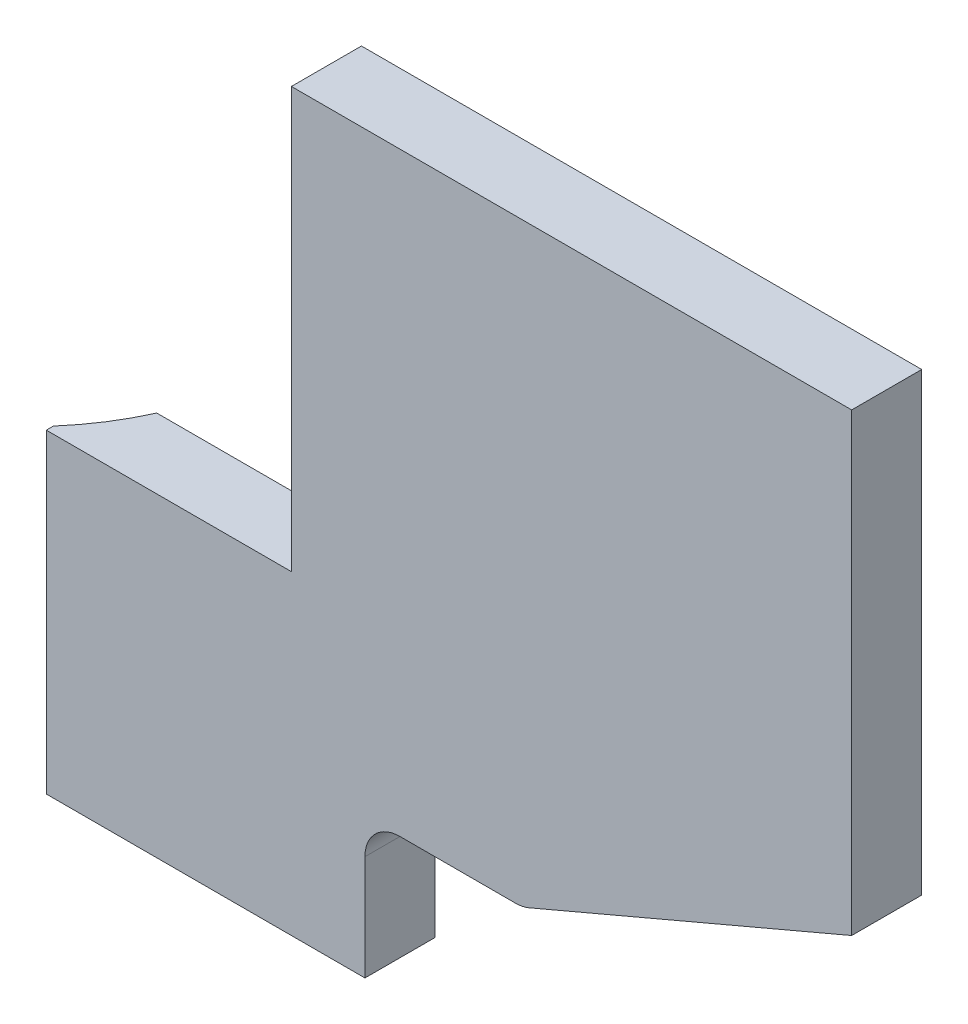
ISO-10303-21;
HEADER;
FILE_DESCRIPTION(('STEP AP214'),'2;1');
FILE_NAME('part.step','',(''),(''),'','','');
FILE_SCHEMA(('AUTOMOTIVE_DESIGN { 1 0 10303 214 1 1 1 1 }'));
ENDSEC;
DATA;
#1=APPLICATION_CONTEXT('core data for automotive mechanical design processes');
#2=APPLICATION_PROTOCOL_DEFINITION('international standard','automotive_design',2000,#1);
#3=PRODUCT_CONTEXT('',#1,'mechanical');
#4=PRODUCT('Part','Part','',(#3));
#5=PRODUCT_RELATED_PRODUCT_CATEGORY('part','',(#4));
#6=PRODUCT_DEFINITION_FORMATION('','',#4);
#7=PRODUCT_DEFINITION_CONTEXT('part definition',#1,'design');
#8=PRODUCT_DEFINITION('design','',#6,#7);
#9=PRODUCT_DEFINITION_SHAPE('','',#8);
#10=(LENGTH_UNIT() NAMED_UNIT(*) SI_UNIT(.MILLI.,.METRE.));
#11=(NAMED_UNIT(*) PLANE_ANGLE_UNIT() SI_UNIT($,.RADIAN.));
#12=(NAMED_UNIT(*) SI_UNIT($,.STERADIAN.) SOLID_ANGLE_UNIT());
#13=UNCERTAINTY_MEASURE_WITH_UNIT(LENGTH_MEASURE(1.E-05),#10,'distance_accuracy_value','');
#14=(GEOMETRIC_REPRESENTATION_CONTEXT(3) GLOBAL_UNCERTAINTY_ASSIGNED_CONTEXT((#13)) GLOBAL_UNIT_ASSIGNED_CONTEXT((#10,
#11,#12)) REPRESENTATION_CONTEXT('',''));
#15=CARTESIAN_POINT('',(0.,0.,0.));
#16=DIRECTION('',(0.,0.,1.));
#17=DIRECTION('',(1.,0.,0.));
#18=AXIS2_PLACEMENT_3D('',#15,#16,#17);
#19=CARTESIAN_POINT('',(0.,-72.5,0.));
#20=DIRECTION('',(0.,-1.,0.));
#21=DIRECTION('',(0.,0.,-1.));
#22=AXIS2_PLACEMENT_3D('',#19,#20,#21);
#23=PLANE('',#22);
#24=DIRECTION('',(1.,0.,0.));
#25=VECTOR('',#24,1.);
#26=CARTESIAN_POINT('',(-40.,-72.5,0.));
#27=LINE('',#26,#25);
#28=CARTESIAN_POINT('',(-69.2246337360503,-72.5,0.));
#29=VERTEX_POINT('',#28);
#30=CARTESIAN_POINT('',(-29.5,-72.5,0.));
#31=VERTEX_POINT('',#30);
#32=EDGE_CURVE('E144',#29,#31,#27,.T.);
#33=ORIENTED_EDGE('',*,*,#32,.T.);
#34=DIRECTION('',(0.,0.,1.));
#35=VECTOR('',#34,1.);
#36=CARTESIAN_POINT('',(-29.5,-72.5,0.));
#37=LINE('',#36,#35);
#38=CARTESIAN_POINT('',(-29.5,-72.5,10.));
#39=VERTEX_POINT('',#38);
#40=EDGE_CURVE('E126',#31,#39,#37,.T.);
#41=ORIENTED_EDGE('',*,*,#40,.T.);
#42=DIRECTION('',(-1.,0.,0.));
#43=VECTOR('',#42,1.);
#44=CARTESIAN_POINT('',(-40.,-72.5,10.));
#45=LINE('',#44,#43);
#46=CARTESIAN_POINT('',(-75.,-72.5,10.));
#47=VERTEX_POINT('',#46);
#48=EDGE_CURVE('E147',#39,#47,#45,.T.);
#49=ORIENTED_EDGE('',*,*,#48,.T.);
#50=DIRECTION('',(0.,0.,1.));
#51=VECTOR('',#50,1.);
#52=CARTESIAN_POINT('',(-75.,-72.5,0.));
#53=LINE('',#52,#51);
#54=CARTESIAN_POINT('',(-75.,-72.5,9.));
#55=VERTEX_POINT('',#54);
#56=EDGE_CURVE('E199',#55,#47,#53,.T.);
#57=ORIENTED_EDGE('',*,*,#56,.F.);
#58=CARTESIAN_POINT('',(-102.5,-72.5,-15.));
#59=DIRECTION('',(0.,1.,0.));
#60=DIRECTION('',(-1.,0.,0.));
#61=AXIS2_PLACEMENT_3D('',#58,#59,#60);
#62=CIRCLE('',#61,36.5);
#63=EDGE_CURVE('E61',#55,#29,#62,.T.);
#64=ORIENTED_EDGE('',*,*,#63,.T.);
#65=EDGE_LOOP('',(#33,#41,#49,#57,#64));
#66=FACE_BOUND('',#65,.T.);
#67=ADVANCED_FACE('F39',(#66),#23,.T.);
#68=CARTESIAN_POINT('',(40.,-32.5,10.));
#69=DIRECTION('',(-1.,0.,0.));
#70=DIRECTION('',(0.,0.,1.));
#71=AXIS2_PLACEMENT_3D('',#68,#69,#70);
#72=PLANE('',#71);
#73=DIRECTION('',(0.,0.,1.));
#74=VECTOR('',#73,1.);
#75=CARTESIAN_POINT('',(40.,-32.5,0.));
#76=LINE('',#75,#74);
#77=CARTESIAN_POINT('',(40.,-32.5,0.));
#78=VERTEX_POINT('',#77);
#79=CARTESIAN_POINT('',(40.,-32.5,10.));
#80=VERTEX_POINT('',#79);
#81=EDGE_CURVE('E140',#78,#80,#76,.T.);
#82=ORIENTED_EDGE('',*,*,#81,.F.);
#83=DIRECTION('',(0.,1.,0.));
#84=VECTOR('',#83,1.);
#85=CARTESIAN_POINT('',(40.,-32.5,0.));
#86=LINE('',#85,#84);
#87=CARTESIAN_POINT('',(40.,32.5,0.));
#88=VERTEX_POINT('',#87);
#89=EDGE_CURVE('E161',#78,#88,#86,.T.);
#90=ORIENTED_EDGE('',*,*,#89,.T.);
#91=DIRECTION('',(0.,0.,-1.));
#92=VECTOR('',#91,1.);
#93=CARTESIAN_POINT('',(40.,32.5,10.));
#94=LINE('',#93,#92);
#95=CARTESIAN_POINT('',(40.,32.5,10.));
#96=VERTEX_POINT('',#95);
#97=EDGE_CURVE('E50',#96,#88,#94,.T.);
#98=ORIENTED_EDGE('',*,*,#97,.F.);
#99=DIRECTION('',(0.,1.,0.));
#100=VECTOR('',#99,1.);
#101=CARTESIAN_POINT('',(40.,-32.5,10.));
#102=LINE('',#101,#100);
#103=EDGE_CURVE('E168',#80,#96,#102,.T.);
#104=ORIENTED_EDGE('',*,*,#103,.F.);
#105=EDGE_LOOP('',(#82,#90,#98,#104));
#106=FACE_BOUND('',#105,.T.);
#107=ADVANCED_FACE('F239',(#106),#72,.F.);
#108=CARTESIAN_POINT('',(-75.,-27.5,0.));
#109=DIRECTION('',(0.,-1.,0.));
#110=DIRECTION('',(1.,0.,0.));
#111=AXIS2_PLACEMENT_3D('',#108,#109,#110);
#112=PLANE('',#111);
#113=CARTESIAN_POINT('',(-102.5,-27.5,-15.));
#114=DIRECTION('',(0.,1.,0.));
#115=DIRECTION('',(-1.,0.,0.));
#116=AXIS2_PLACEMENT_3D('',#113,#114,#115);
#117=CIRCLE('',#116,36.5);
#118=CARTESIAN_POINT('',(-75.,-27.5,9.00000000000002));
#119=VERTEX_POINT('',#118);
#120=CARTESIAN_POINT('',(-69.2246337360503,-27.5,0.));
#121=VERTEX_POINT('',#120);
#122=EDGE_CURVE('E202',#119,#121,#117,.T.);
#123=ORIENTED_EDGE('',*,*,#122,.F.);
#124=DIRECTION('',(0.,0.,-1.));
#125=VECTOR('',#124,1.);
#126=CARTESIAN_POINT('',(-75.,-27.5,0.));
#127=LINE('',#126,#125);
#128=CARTESIAN_POINT('',(-75.,-27.5,10.));
#129=VERTEX_POINT('',#128);
#130=EDGE_CURVE('E191',#129,#119,#127,.T.);
#131=ORIENTED_EDGE('',*,*,#130,.F.);
#132=DIRECTION('',(1.,0.,0.));
#133=VECTOR('',#132,1.);
#134=CARTESIAN_POINT('',(-75.,-27.5,10.));
#135=LINE('',#134,#133);
#136=CARTESIAN_POINT('',(-40.,-27.5,10.));
#137=VERTEX_POINT('',#136);
#138=EDGE_CURVE('E151',#129,#137,#135,.T.);
#139=ORIENTED_EDGE('',*,*,#138,.T.);
#140=DIRECTION('',(0.,0.,-1.));
#141=VECTOR('',#140,1.);
#142=CARTESIAN_POINT('',(-40.,-27.5,0.));
#143=LINE('',#142,#141);
#144=CARTESIAN_POINT('',(-40.,-27.5,0.));
#145=VERTEX_POINT('',#144);
#146=EDGE_CURVE('E197',#137,#145,#143,.T.);
#147=ORIENTED_EDGE('',*,*,#146,.T.);
#148=DIRECTION('',(1.,0.,0.));
#149=VECTOR('',#148,1.);
#150=CARTESIAN_POINT('',(-75.,-27.5,0.));
#151=LINE('',#150,#149);
#152=EDGE_CURVE('E156',#121,#145,#151,.T.);
#153=ORIENTED_EDGE('',*,*,#152,.F.);
#154=EDGE_LOOP('',(#123,#131,#139,#147,#153));
#155=FACE_BOUND('',#154,.T.);
#156=ADVANCED_FACE('F266',(#155),#112,.F.);
#157=CARTESIAN_POINT('',(-40.,-32.5,10.));
#158=DIRECTION('',(-1.,0.,0.));
#159=DIRECTION('',(0.,-1.,0.));
#160=AXIS2_PLACEMENT_3D('',#157,#158,#159);
#161=PLANE('',#160);
#162=ORIENTED_EDGE('',*,*,#146,.F.);
#163=DIRECTION('',(0.,1.,0.));
#164=VECTOR('',#163,1.);
#165=CARTESIAN_POINT('',(-40.,-32.5,10.));
#166=LINE('',#165,#164);
#167=CARTESIAN_POINT('',(-40.,32.5,10.));
#168=VERTEX_POINT('',#167);
#169=EDGE_CURVE('E159',#137,#168,#166,.T.);
#170=ORIENTED_EDGE('',*,*,#169,.T.);
#171=DIRECTION('',(0.,0.,-1.));
#172=VECTOR('',#171,1.);
#173=CARTESIAN_POINT('',(-40.,32.5,10.));
#174=LINE('',#173,#172);
#175=CARTESIAN_POINT('',(-40.,32.5,0.));
#176=VERTEX_POINT('',#175);
#177=EDGE_CURVE('E166',#168,#176,#174,.T.);
#178=ORIENTED_EDGE('',*,*,#177,.T.);
#179=DIRECTION('',(0.,1.,0.));
#180=VECTOR('',#179,1.);
#181=CARTESIAN_POINT('',(-40.,-32.5,0.));
#182=LINE('',#181,#180);
#183=EDGE_CURVE('E154',#145,#176,#182,.T.);
#184=ORIENTED_EDGE('',*,*,#183,.F.);
#185=EDGE_LOOP('',(#162,#170,#178,#184));
#186=FACE_BOUND('',#185,.T.);
#187=ADVANCED_FACE('F41',(#186),#161,.T.);
#188=CARTESIAN_POINT('',(-40.,32.5,10.));
#189=DIRECTION('',(0.,1.,0.));
#190=DIRECTION('',(-1.,0.,0.));
#191=AXIS2_PLACEMENT_3D('',#188,#189,#190);
#192=PLANE('',#191);
#193=DIRECTION('',(1.,0.,0.));
#194=VECTOR('',#193,1.);
#195=CARTESIAN_POINT('',(-40.,32.5,0.));
#196=LINE('',#195,#194);
#197=EDGE_CURVE('E167',#176,#88,#196,.T.);
#198=ORIENTED_EDGE('',*,*,#197,.F.);
#199=ORIENTED_EDGE('',*,*,#177,.F.);
#200=DIRECTION('',(1.,0.,0.));
#201=VECTOR('',#200,1.);
#202=CARTESIAN_POINT('',(-40.,32.5,10.));
#203=LINE('',#202,#201);
#204=EDGE_CURVE('E162',#168,#96,#203,.T.);
#205=ORIENTED_EDGE('',*,*,#204,.T.);
#206=ORIENTED_EDGE('',*,*,#97,.T.);
#207=EDGE_LOOP('',(#198,#199,#205,#206));
#208=FACE_BOUND('',#207,.T.);
#209=ADVANCED_FACE('F183',(#208),#192,.T.);
#210=CARTESIAN_POINT('',(0.,0.,10.));
#211=DIRECTION('',(0.,0.,-1.));
#212=DIRECTION('',(-1.,0.,0.));
#213=AXIS2_PLACEMENT_3D('',#210,#211,#212);
#214=PLANE('',#213);
#215=DIRECTION('',(0.,-1.,0.));
#216=VECTOR('',#215,1.);
#217=CARTESIAN_POINT('',(-29.5,-72.5,10.));
#218=LINE('',#217,#216);
#219=CARTESIAN_POINT('',(-29.5,-57.5,10.));
#220=VERTEX_POINT('',#219);
#221=EDGE_CURVE('E134',#220,#39,#218,.T.);
#222=ORIENTED_EDGE('',*,*,#221,.F.);
#223=CARTESIAN_POINT('',(-24.5,-57.5,10.));
#224=DIRECTION('',(0.,0.,1.));
#225=DIRECTION('',(-1.,0.,0.));
#226=AXIS2_PLACEMENT_3D('',#223,#224,#225);
#227=CIRCLE('',#226,5.);
#228=CARTESIAN_POINT('',(-24.5,-52.5,10.));
#229=VERTEX_POINT('',#228);
#230=EDGE_CURVE('E146',#229,#220,#227,.T.);
#231=ORIENTED_EDGE('',*,*,#230,.F.);
#232=DIRECTION('',(-1.,0.,0.));
#233=VECTOR('',#232,1.);
#234=CARTESIAN_POINT('',(-24.5,-52.5,10.));
#235=LINE('',#234,#233);
#236=CARTESIAN_POINT('',(-8.01959278912215,-52.5,10.));
#237=VERTEX_POINT('',#236);
#238=EDGE_CURVE('E219',#237,#229,#235,.T.);
#239=ORIENTED_EDGE('',*,*,#238,.F.);
#240=CARTESIAN_POINT('',(-8.01959278912214,-47.5,10.));
#241=DIRECTION('',(0.,0.,-1.));
#242=DIRECTION('',(1.,0.,0.));
#243=AXIS2_PLACEMENT_3D('',#240,#241,#242);
#244=CIRCLE('',#243,5.);
#245=CARTESIAN_POINT('',(-6.06181696863581,-52.1007731781429,10.));
#246=VERTEX_POINT('',#245);
#247=EDGE_CURVE('E221',#246,#237,#244,.T.);
#248=ORIENTED_EDGE('',*,*,#247,.F.);
#249=DIRECTION('',(-0.920154635628579,-0.391555164097267,0.));
#250=VECTOR('',#249,1.);
#251=CARTESIAN_POINT('',(-6.06181696863581,-52.1007731781429,10.));
#252=LINE('',#251,#250);
#253=EDGE_CURVE('E222',#80,#246,#252,.T.);
#254=ORIENTED_EDGE('',*,*,#253,.F.);
#255=ORIENTED_EDGE('',*,*,#103,.T.);
#256=ORIENTED_EDGE('',*,*,#204,.F.);
#257=ORIENTED_EDGE('',*,*,#169,.F.);
#258=ORIENTED_EDGE('',*,*,#138,.F.);
#259=DIRECTION('',(0.,1.,0.));
#260=VECTOR('',#259,1.);
#261=CARTESIAN_POINT('',(-75.,-72.5,10.));
#262=LINE('',#261,#260);
#263=EDGE_CURVE('E193',#47,#129,#262,.T.);
#264=ORIENTED_EDGE('',*,*,#263,.F.);
#265=ORIENTED_EDGE('',*,*,#48,.F.);
#266=EDGE_LOOP('',(#222,#231,#239,#248,#254,#255,#256,#257,#258,#264,#265));
#267=FACE_BOUND('',#266,.T.);
#268=ADVANCED_FACE('F245',(#267),#214,.F.);
#269=CARTESIAN_POINT('',(0.,0.,0.));
#270=DIRECTION('',(0.,0.,-1.));
#271=DIRECTION('',(-1.,0.,0.));
#272=AXIS2_PLACEMENT_3D('',#269,#270,#271);
#273=PLANE('',#272);
#274=CARTESIAN_POINT('',(-24.5,-57.5,0.));
#275=DIRECTION('',(0.,0.,1.));
#276=DIRECTION('',(-1.,0.,0.));
#277=AXIS2_PLACEMENT_3D('',#274,#275,#276);
#278=CIRCLE('',#277,5.);
#279=CARTESIAN_POINT('',(-24.5,-52.5,0.));
#280=VERTEX_POINT('',#279);
#281=CARTESIAN_POINT('',(-29.5,-57.5,0.));
#282=VERTEX_POINT('',#281);
#283=EDGE_CURVE('E138',#280,#282,#278,.T.);
#284=ORIENTED_EDGE('',*,*,#283,.T.);
#285=DIRECTION('',(0.,-1.,0.));
#286=VECTOR('',#285,1.);
#287=CARTESIAN_POINT('',(-29.5,-72.5,0.));
#288=LINE('',#287,#286);
#289=EDGE_CURVE('E127',#282,#31,#288,.T.);
#290=ORIENTED_EDGE('',*,*,#289,.T.);
#291=ORIENTED_EDGE('',*,*,#32,.F.);
#292=DIRECTION('',(0.,1.,0.));
#293=VECTOR('',#292,1.);
#294=CARTESIAN_POINT('',(-69.2246337360503,-72.5,0.));
#295=LINE('',#294,#293);
#296=EDGE_CURVE('E186',#121,#29,#295,.F.);
#297=ORIENTED_EDGE('',*,*,#296,.F.);
#298=ORIENTED_EDGE('',*,*,#152,.T.);
#299=ORIENTED_EDGE('',*,*,#183,.T.);
#300=ORIENTED_EDGE('',*,*,#197,.T.);
#301=ORIENTED_EDGE('',*,*,#89,.F.);
#302=DIRECTION('',(-0.920154635628579,-0.391555164097267,0.));
#303=VECTOR('',#302,1.);
#304=CARTESIAN_POINT('',(-6.06181696863581,-52.1007731781429,0.));
#305=LINE('',#304,#303);
#306=CARTESIAN_POINT('',(-6.06181696863581,-52.1007731781429,0.));
#307=VERTEX_POINT('',#306);
#308=EDGE_CURVE('E149',#78,#307,#305,.T.);
#309=ORIENTED_EDGE('',*,*,#308,.T.);
#310=CARTESIAN_POINT('',(-8.01959278912214,-47.5,0.));
#311=DIRECTION('',(0.,0.,-1.));
#312=DIRECTION('',(1.,0.,0.));
#313=AXIS2_PLACEMENT_3D('',#310,#311,#312);
#314=CIRCLE('',#313,5.);
#315=CARTESIAN_POINT('',(-8.01959278912215,-52.5,0.));
#316=VERTEX_POINT('',#315);
#317=EDGE_CURVE('E229',#307,#316,#314,.T.);
#318=ORIENTED_EDGE('',*,*,#317,.T.);
#319=DIRECTION('',(-1.,0.,0.));
#320=VECTOR('',#319,1.);
#321=CARTESIAN_POINT('',(-24.5,-52.5,0.));
#322=LINE('',#321,#320);
#323=EDGE_CURVE('E53',#316,#280,#322,.T.);
#324=ORIENTED_EDGE('',*,*,#323,.T.);
#325=EDGE_LOOP('',(#284,#290,#291,#297,#298,#299,#300,#301,#309,#318,#324));
#326=FACE_BOUND('',#325,.T.);
#327=ADVANCED_FACE('F145',(#326),#273,.T.);
#328=CARTESIAN_POINT('',(-75.,0.,0.));
#329=DIRECTION('',(1.,0.,0.));
#330=DIRECTION('',(0.,1.,0.));
#331=AXIS2_PLACEMENT_3D('',#328,#329,#330);
#332=PLANE('',#331);
#333=ORIENTED_EDGE('',*,*,#130,.T.);
#334=DIRECTION('',(0.,1.,0.));
#335=VECTOR('',#334,1.);
#336=CARTESIAN_POINT('',(-75.,-72.5,9.00000000000001));
#337=LINE('',#336,#335);
#338=EDGE_CURVE('E11',#119,#55,#337,.F.);
#339=ORIENTED_EDGE('',*,*,#338,.T.);
#340=ORIENTED_EDGE('',*,*,#56,.T.);
#341=ORIENTED_EDGE('',*,*,#263,.T.);
#342=EDGE_LOOP('',(#333,#339,#340,#341));
#343=FACE_BOUND('',#342,.T.);
#344=ADVANCED_FACE('F274',(#343),#332,.F.);
#345=CARTESIAN_POINT('',(-102.5,-72.5,-15.));
#346=DIRECTION('',(0.,1.,0.));
#347=DIRECTION('',(-1.,0.,0.));
#348=AXIS2_PLACEMENT_3D('',#345,#346,#347);
#349=CYLINDRICAL_SURFACE('',#348,36.5);
#350=ORIENTED_EDGE('',*,*,#296,.T.);
#351=ORIENTED_EDGE('',*,*,#63,.F.);
#352=ORIENTED_EDGE('',*,*,#338,.F.);
#353=ORIENTED_EDGE('',*,*,#122,.T.);
#354=EDGE_LOOP('',(#350,#351,#352,#353));
#355=FACE_BOUND('',#354,.T.);
#356=ADVANCED_FACE('F260',(#355),#349,.F.);
#357=CARTESIAN_POINT('',(-29.5,-72.5,0.));
#358=DIRECTION('',(-1.,0.,0.));
#359=DIRECTION('',(0.,0.,1.));
#360=AXIS2_PLACEMENT_3D('',#357,#358,#359);
#361=PLANE('',#360);
#362=ORIENTED_EDGE('',*,*,#221,.T.);
#363=ORIENTED_EDGE('',*,*,#40,.F.);
#364=ORIENTED_EDGE('',*,*,#289,.F.);
#365=DIRECTION('',(0.,0.,1.));
#366=VECTOR('',#365,1.);
#367=CARTESIAN_POINT('',(-29.5,-57.5,0.));
#368=LINE('',#367,#366);
#369=EDGE_CURVE('E207',#282,#220,#368,.T.);
#370=ORIENTED_EDGE('',*,*,#369,.T.);
#371=EDGE_LOOP('',(#362,#363,#364,#370));
#372=FACE_BOUND('',#371,.T.);
#373=ADVANCED_FACE('F128',(#372),#361,.F.);
#374=CARTESIAN_POINT('',(-24.5,-57.5,0.));
#375=DIRECTION('',(0.,0.,1.));
#376=DIRECTION('',(1.,0.,0.));
#377=AXIS2_PLACEMENT_3D('',#374,#375,#376);
#378=CYLINDRICAL_SURFACE('',#377,5.);
#379=ORIENTED_EDGE('',*,*,#230,.T.);
#380=ORIENTED_EDGE('',*,*,#369,.F.);
#381=ORIENTED_EDGE('',*,*,#283,.F.);
#382=DIRECTION('',(0.,0.,1.));
#383=VECTOR('',#382,1.);
#384=CARTESIAN_POINT('',(-24.5,-52.5,0.));
#385=LINE('',#384,#383);
#386=EDGE_CURVE('E215',#280,#229,#385,.T.);
#387=ORIENTED_EDGE('',*,*,#386,.T.);
#388=EDGE_LOOP('',(#379,#380,#381,#387));
#389=FACE_BOUND('',#388,.T.);
#390=ADVANCED_FACE('F249',(#389),#378,.F.);
#391=CARTESIAN_POINT('',(-24.5,-52.5,0.));
#392=DIRECTION('',(0.,1.,0.));
#393=DIRECTION('',(-1.,0.,0.));
#394=AXIS2_PLACEMENT_3D('',#391,#392,#393);
#395=PLANE('',#394);
#396=ORIENTED_EDGE('',*,*,#238,.T.);
#397=ORIENTED_EDGE('',*,*,#386,.F.);
#398=ORIENTED_EDGE('',*,*,#323,.F.);
#399=DIRECTION('',(0.,0.,1.));
#400=VECTOR('',#399,1.);
#401=CARTESIAN_POINT('',(-8.01959278912215,-52.5,0.));
#402=LINE('',#401,#400);
#403=EDGE_CURVE('E214',#316,#237,#402,.T.);
#404=ORIENTED_EDGE('',*,*,#403,.T.);
#405=EDGE_LOOP('',(#396,#397,#398,#404));
#406=FACE_BOUND('',#405,.T.);
#407=ADVANCED_FACE('F247',(#406),#395,.F.);
#408=CARTESIAN_POINT('',(-8.01959278912214,-47.5,0.));
#409=DIRECTION('',(0.,0.,1.));
#410=DIRECTION('',(1.,0.,0.));
#411=AXIS2_PLACEMENT_3D('',#408,#409,#410);
#412=CYLINDRICAL_SURFACE('',#411,5.);
#413=ORIENTED_EDGE('',*,*,#247,.T.);
#414=ORIENTED_EDGE('',*,*,#403,.F.);
#415=ORIENTED_EDGE('',*,*,#317,.F.);
#416=DIRECTION('',(0.,0.,1.));
#417=VECTOR('',#416,1.);
#418=CARTESIAN_POINT('',(-6.06181696863581,-52.1007731781429,0.));
#419=LINE('',#418,#417);
#420=EDGE_CURVE('E209',#307,#246,#419,.T.);
#421=ORIENTED_EDGE('',*,*,#420,.T.);
#422=EDGE_LOOP('',(#413,#414,#415,#421));
#423=FACE_BOUND('',#422,.T.);
#424=ADVANCED_FACE('F250',(#423),#412,.T.);
#425=CARTESIAN_POINT('',(-6.06181696863581,-52.1007731781429,0.));
#426=DIRECTION('',(-0.391555164097267,0.920154635628578,0.));
#427=DIRECTION('',(-0.920154635628578,-0.391555164097267,0.));
#428=AXIS2_PLACEMENT_3D('',#425,#426,#427);
#429=PLANE('',#428);
#430=ORIENTED_EDGE('',*,*,#253,.T.);
#431=ORIENTED_EDGE('',*,*,#420,.F.);
#432=ORIENTED_EDGE('',*,*,#308,.F.);
#433=ORIENTED_EDGE('',*,*,#81,.T.);
#434=EDGE_LOOP('',(#430,#431,#432,#433));
#435=FACE_BOUND('',#434,.T.);
#436=ADVANCED_FACE('F236',(#435),#429,.F.);
#437=CLOSED_SHELL('',(#67,#107,#156,#187,#209,#268,#327,#344,#356,#373,#390,#407,#424,#436));
#438=MANIFOLD_SOLID_BREP('B2',#437);
#439=ADVANCED_BREP_SHAPE_REPRESENTATION('',(#18,#438),#14);
#440=SHAPE_DEFINITION_REPRESENTATION(#9,#439);
ENDSEC;
END-ISO-10303-21;
